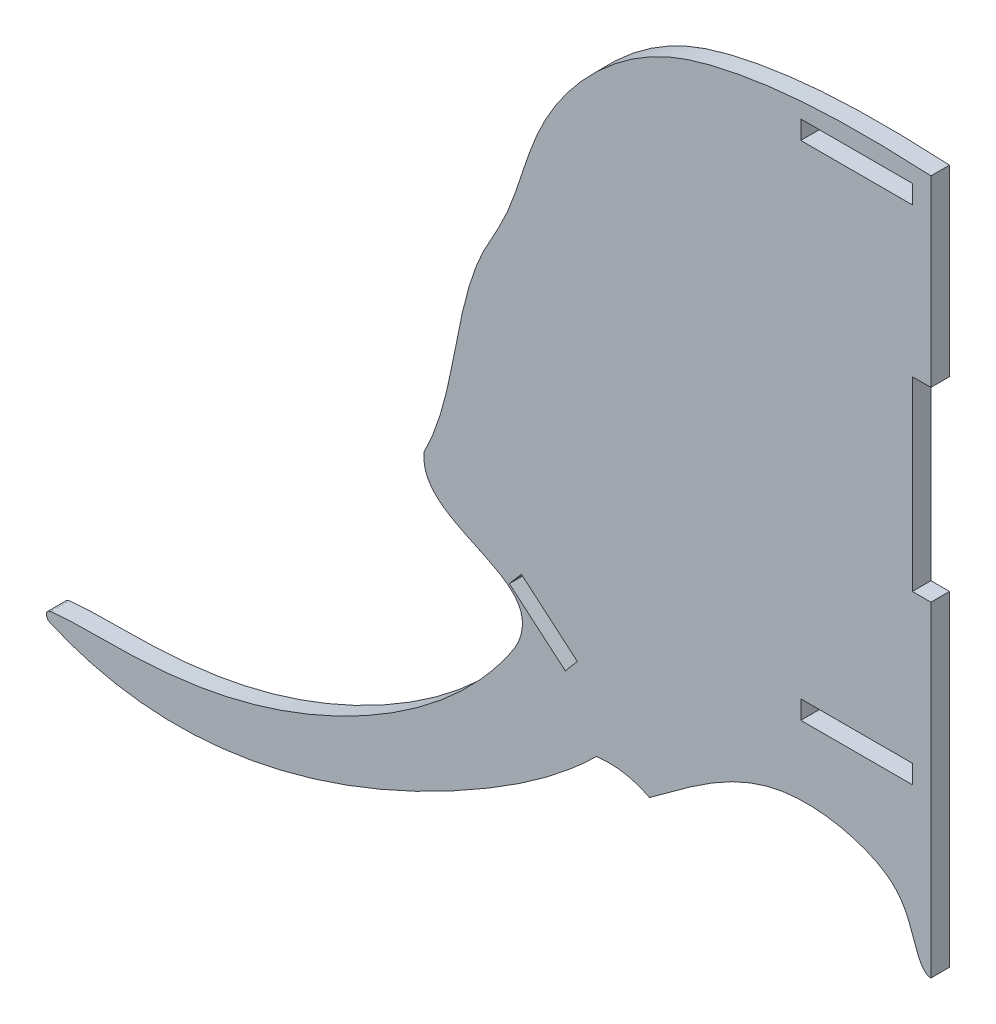
ISO-10303-21;
HEADER;
FILE_DESCRIPTION(('STEP AP214'),'2;1');
FILE_NAME('part.step','',(''),(''),'','','');
FILE_SCHEMA(('AUTOMOTIVE_DESIGN { 1 0 10303 214 1 1 1 1 }'));
ENDSEC;
DATA;
#1=APPLICATION_CONTEXT('core data for automotive mechanical design processes');
#2=APPLICATION_PROTOCOL_DEFINITION('international standard','automotive_design',2000,#1);
#3=PRODUCT_CONTEXT('',#1,'mechanical');
#4=PRODUCT('Part','Part','',(#3));
#5=PRODUCT_RELATED_PRODUCT_CATEGORY('part','',(#4));
#6=PRODUCT_DEFINITION_FORMATION('','',#4);
#7=PRODUCT_DEFINITION_CONTEXT('part definition',#1,'design');
#8=PRODUCT_DEFINITION('design','',#6,#7);
#9=PRODUCT_DEFINITION_SHAPE('','',#8);
#10=(LENGTH_UNIT() NAMED_UNIT(*) SI_UNIT(.MILLI.,.METRE.));
#11=(NAMED_UNIT(*) PLANE_ANGLE_UNIT() SI_UNIT($,.RADIAN.));
#12=(NAMED_UNIT(*) SI_UNIT($,.STERADIAN.) SOLID_ANGLE_UNIT());
#13=UNCERTAINTY_MEASURE_WITH_UNIT(LENGTH_MEASURE(1.E-05),#10,'distance_accuracy_value','');
#14=(GEOMETRIC_REPRESENTATION_CONTEXT(3) GLOBAL_UNCERTAINTY_ASSIGNED_CONTEXT((#13)) GLOBAL_UNIT_ASSIGNED_CONTEXT((#10,
#11,#12)) REPRESENTATION_CONTEXT('',''));
#15=CARTESIAN_POINT('',(0.,0.,0.));
#16=DIRECTION('',(0.,0.,1.));
#17=DIRECTION('',(1.,0.,0.));
#18=AXIS2_PLACEMENT_3D('',#15,#16,#17);
#19=CARTESIAN_POINT('',(94.508573501451,247.967712181637,3.73356069203025));
#20=DIRECTION('',(0.,0.,1.));
#21=DIRECTION('',(1.,0.,0.));
#22=AXIS2_PLACEMENT_3D('',#19,#20,#21);
#23=PLANE('',#22);
#24=DIRECTION('',(1.,0.,0.));
#25=VECTOR('',#24,1.);
#26=CARTESIAN_POINT('',(94.508573501451,311.602433565563,3.73356069203025));
#27=LINE('',#26,#25);
#28=CARTESIAN_POINT('',(185.419370335576,311.602433565563,3.73356069203025));
#29=VERTEX_POINT('',#28);
#30=CARTESIAN_POINT('',(188.594370335576,311.602433565563,3.73356069203025));
#31=VERTEX_POINT('',#30);
#32=EDGE_CURVE('E231',#29,#31,#27,.T.);
#33=ORIENTED_EDGE('',*,*,#32,.F.);
#34=DIRECTION('',(0.,1.,0.));
#35=VECTOR('',#34,1.);
#36=CARTESIAN_POINT('',(185.419370335576,247.967712181637,3.73356069203025));
#37=LINE('',#36,#35);
#38=CARTESIAN_POINT('',(185.419370335576,343.352433565563,3.73356069203025));
#39=VERTEX_POINT('',#38);
#40=EDGE_CURVE('E233',#29,#39,#37,.T.);
#41=ORIENTED_EDGE('',*,*,#40,.T.);
#42=DIRECTION('',(-1.,0.,0.));
#43=VECTOR('',#42,1.);
#44=CARTESIAN_POINT('',(94.508573501451,343.352433565563,3.73356069203025));
#45=LINE('',#44,#43);
#46=CARTESIAN_POINT('',(188.594370335576,343.352433565563,3.73356069203025));
#47=VERTEX_POINT('',#46);
#48=EDGE_CURVE('E228',#47,#39,#45,.T.);
#49=ORIENTED_EDGE('',*,*,#48,.F.);
#50=DIRECTION('',(0.,1.,0.));
#51=VECTOR('',#50,1.);
#52=CARTESIAN_POINT('',(188.594370335576,256.044180784674,3.73356069203025));
#53=LINE('',#52,#51);
#54=CARTESIAN_POINT('',(188.594370335576,374.625359774708,3.73356069203025));
#55=VERTEX_POINT('',#54);
#56=EDGE_CURVE('E325',#47,#55,#53,.T.);
#57=ORIENTED_EDGE('',*,*,#56,.T.);
#58=CARTESIAN_POINT('',(188.594370335576,374.625359774708,3.73356069203025));
#59=CARTESIAN_POINT('',(176.902723498998,375.254038594376,3.73356069203025));
#60=CARTESIAN_POINT('',(161.721869193318,375.20352020384,3.73356069203025));
#61=CARTESIAN_POINT('',(141.653036259614,369.727996039066,3.73356069203025));
#62=CARTESIAN_POINT('',(129.844490344447,361.163013950383,3.73356069203025));
#63=CARTESIAN_POINT('',(120.192543148774,347.193584535558,3.73356069203025));
#64=CARTESIAN_POINT('',(117.468157819055,334.135539263181,3.73356069203025));
#65=CARTESIAN_POINT('',(106.783979956067,317.107780222526,3.73356069203025));
#66=CARTESIAN_POINT('',(107.748821991235,301.358066115973,3.73356069203025));
#67=CARTESIAN_POINT('',(102.099863307551,290.688486019018,3.73356069203025));
#68=B_SPLINE_CURVE_WITH_KNOTS('',3,(#58,#59,#60,#61,#62,#63,#64,#65,#66,#67),.UNSPECIFIED.,.F.,
.F.,(4,1,1,1,1,1,1,4),(0.,0.256177885566044,0.326770854067347,0.450574258980141,
0.564972920578244,0.689615914149957,0.73575471902178,1.),.UNSPECIFIED.);
#69=CARTESIAN_POINT('',(102.099863307551,290.688486019018,3.73356069203025));
#70=VERTEX_POINT('',#69);
#71=EDGE_CURVE('E332',#55,#70,#68,.T.);
#72=ORIENTED_EDGE('',*,*,#71,.T.);
#73=CARTESIAN_POINT('',(102.099863307551,290.688486019018,3.73356069203025));
#74=CARTESIAN_POINT('',(100.916580225008,281.167967764217,3.73356069203025));
#75=CARTESIAN_POINT('',(120.273282846945,281.610546577158,3.73356069203025));
#76=CARTESIAN_POINT('',(118.535983847767,270.809071152293,3.73356069203025));
#77=CARTESIAN_POINT('',(110.43237198474,258.237819372774,3.73356069203025));
#78=CARTESIAN_POINT('',(91.5085668329795,244.241619737673,3.73356069203025));
#79=CARTESIAN_POINT('',(67.0085052705129,236.394505854137,3.73356069203025));
#80=CARTESIAN_POINT('',(50.2391887562681,235.276016557089,3.73356069203025));
#81=CARTESIAN_POINT('',(41.9604942993806,235.532539786131,3.73356069203025));
#82=CARTESIAN_POINT('',(37.1175600327286,234.971365473784,3.73356069203025));
#83=CARTESIAN_POINT('',(37.8679406667928,233.541882506608,3.73356069203025));
#84=B_SPLINE_CURVE_WITH_KNOTS('',3,(#73,#74,#75,#76,#77,#78,#79,#80,#81,#82,#83),.UNSPECIFIED.,
.F.,.F.,(4,1,1,1,1,1,1,1,4),(0.,0.196782075044125,0.221956903579895,0.252894603761857,
0.570283935596533,0.77661171671314,0.895160825028523,0.978618526289838,1.),.UNSPECIFIED.);
#85=CARTESIAN_POINT('',(37.8679406667928,233.541882506608,3.73356069203025));
#86=VERTEX_POINT('',#85);
#87=EDGE_CURVE('E283',#70,#86,#84,.T.);
#88=ORIENTED_EDGE('',*,*,#87,.T.);
#89=CARTESIAN_POINT('',(37.8679406667928,233.541882506608,3.73356069203025));
#90=CARTESIAN_POINT('',(60.9779467391012,223.19058600784,3.73356069203025));
#91=CARTESIAN_POINT('',(98.116578730049,235.45119219111,3.73356069203025));
#92=CARTESIAN_POINT('',(125.24952284959,254.096867227217,3.73356069203025));
#93=CARTESIAN_POINT('',(131.494723697335,260.231386122044,3.73356069203025));
#94=B_SPLINE_CURVE_WITH_KNOTS('',3,(#89,#90,#91,#92,#93),.UNSPECIFIED.,.F.,.F.,(4,1,4),(0.,
0.742486767697281,1.),.UNSPECIFIED.);
#95=CARTESIAN_POINT('',(131.494723697335,260.231386122044,3.73356069203025));
#96=VERTEX_POINT('',#95);
#97=EDGE_CURVE('E289',#86,#96,#94,.T.);
#98=ORIENTED_EDGE('',*,*,#97,.T.);
#99=CARTESIAN_POINT('',(131.494723697335,260.231386122044,3.73356069203025));
#100=CARTESIAN_POINT('',(136.244910578791,260.895631189413,3.73356069203025));
#101=CARTESIAN_POINT('',(140.54397731345,258.699973971625,3.73356069203025));
#102=B_SPLINE_CURVE_WITH_KNOTS('',2,(#99,#100,#101),.UNSPECIFIED.,.F.,.F.,(3,3),(0.,1.),.UNSPECIFIED.);
#103=CARTESIAN_POINT('',(140.54397731345,258.699973971625,3.73356069203025));
#104=VERTEX_POINT('',#103);
#105=EDGE_CURVE('E298',#96,#104,#102,.T.);
#106=ORIENTED_EDGE('',*,*,#105,.T.);
#107=CARTESIAN_POINT('',(140.54397731345,258.699973971625,3.73356069203025));
#108=CARTESIAN_POINT('',(147.482916849391,263.64316592561,3.73356069203025));
#109=CARTESIAN_POINT('',(159.520749813214,274.070026780651,3.73356069203025));
#110=CARTESIAN_POINT('',(180.131162258216,269.516241270706,3.73356069203025));
#111=CARTESIAN_POINT('',(185.103724291734,263.508693907055,3.73356069203025));
#112=CARTESIAN_POINT('',(186.771872354927,256.061026077075,3.73356069203025));
#113=CARTESIAN_POINT('',(188.594370335576,256.044180784674,3.73356069203025));
#114=B_SPLINE_CURVE_WITH_KNOTS('',3,(#107,#108,#109,#110,#111,#112,#113),.UNSPECIFIED.,.F.,.F.,
(4,1,1,1,4),(0.,0.461148567866959,0.724471904206736,0.870774393200556,1.),.UNSPECIFIED.);
#115=CARTESIAN_POINT('',(188.594370335576,256.044180784674,3.73356069203025));
#116=VERTEX_POINT('',#115);
#117=EDGE_CURVE('E320',#104,#116,#114,.T.);
#118=ORIENTED_EDGE('',*,*,#117,.T.);
#119=EDGE_CURVE('E326',#116,#31,#53,.T.);
#120=ORIENTED_EDGE('',*,*,#119,.T.);
#121=EDGE_LOOP('',(#33,#41,#49,#57,#72,#88,#98,#106,#118,#120));
#122=FACE_BOUND('',#121,.T.);
#123=DIRECTION('',(-0.762165840447724,0.647381828332102,0.));
#124=VECTOR('',#123,1.);
#125=CARTESIAN_POINT('',(118.769063521326,276.529707524185,3.73356069203025));
#126=LINE('',#125,#124);
#127=CARTESIAN_POINT('',(126.1776152477,270.236901539735,3.73356069203025));
#128=VERTEX_POINT('',#127);
#129=CARTESIAN_POINT('',(116.61912256808,278.355862189291,3.73356069203025));
#130=VERTEX_POINT('',#129);
#131=EDGE_CURVE('E281',#128,#130,#126,.T.);
#132=ORIENTED_EDGE('',*,*,#131,.T.);
#133=DIRECTION('',(-0.647381828332102,-0.762165840447724,0.));
#134=VECTOR('',#133,1.);
#135=CARTESIAN_POINT('',(134.984727481499,299.977780030622,3.73356069203025));
#136=LINE('',#135,#134);
#137=CARTESIAN_POINT('',(118.674559873035,280.775738732713,3.73356069203025));
#138=VERTEX_POINT('',#137);
#139=EDGE_CURVE('E269',#138,#130,#136,.T.);
#140=ORIENTED_EDGE('',*,*,#139,.F.);
#141=DIRECTION('',(0.762165840447724,-0.647381828332102,0.));
#142=VECTOR('',#141,1.);
#143=CARTESIAN_POINT('',(143.072126770281,260.052504199509,3.73356069203023));
#144=LINE('',#143,#142);
#145=CARTESIAN_POINT('',(128.233052552654,272.656778083156,3.73356069203025));
#146=VERTEX_POINT('',#145);
#147=EDGE_CURVE('E277',#138,#146,#144,.T.);
#148=ORIENTED_EDGE('',*,*,#147,.T.);
#149=DIRECTION('',(-0.647381828332102,-0.762165840447724,0.));
#150=VECTOR('',#149,1.);
#151=CARTESIAN_POINT('',(144.543220161119,291.858819381065,3.73356069203025));
#152=LINE('',#151,#150);
#153=EDGE_CURVE('E260',#146,#128,#152,.T.);
#154=ORIENTED_EDGE('',*,*,#153,.T.);
#155=EDGE_LOOP('',(#132,#140,#148,#154));
#156=FACE_BOUND('',#155,.T.);
#157=DIRECTION('',(0.,1.,0.));
#158=VECTOR('',#157,1.);
#159=CARTESIAN_POINT('',(166.369370335576,368.752433565563,3.73356069167234));
#160=LINE('',#159,#158);
#161=CARTESIAN_POINT('',(166.369370335576,368.752433565563,3.73356069167234));
#162=VERTEX_POINT('',#161);
#163=CARTESIAN_POINT('',(166.369370335576,371.927433565563,3.73356069203025));
#164=VERTEX_POINT('',#163);
#165=EDGE_CURVE('E236',#162,#164,#160,.T.);
#166=ORIENTED_EDGE('',*,*,#165,.T.);
#167=DIRECTION('',(1.,0.,0.));
#168=VECTOR('',#167,1.);
#169=CARTESIAN_POINT('',(-3.32194779276879,371.927433565563,3.73356069167271));
#170=LINE('',#169,#168);
#171=CARTESIAN_POINT('',(185.419370335576,371.927433565563,3.73356069167234));
#172=VERTEX_POINT('',#171);
#173=EDGE_CURVE('E246',#164,#172,#170,.T.);
#174=ORIENTED_EDGE('',*,*,#173,.T.);
#175=DIRECTION('',(0.,1.,0.));
#176=VECTOR('',#175,1.);
#177=CARTESIAN_POINT('',(185.419370335576,368.752433565563,3.73356069167234));
#178=LINE('',#177,#176);
#179=CARTESIAN_POINT('',(185.419370335576,368.752433565563,3.73356069167234));
#180=VERTEX_POINT('',#179);
#181=EDGE_CURVE('E237',#180,#172,#178,.T.);
#182=ORIENTED_EDGE('',*,*,#181,.F.);
#183=DIRECTION('',(1.,0.,0.));
#184=VECTOR('',#183,1.);
#185=CARTESIAN_POINT('',(94.508573501451,368.752433565563,3.73356069203025));
#186=LINE('',#185,#184);
#187=EDGE_CURVE('E252',#162,#180,#186,.T.);
#188=ORIENTED_EDGE('',*,*,#187,.F.);
#189=EDGE_LOOP('',(#166,#174,#182,#188));
#190=FACE_BOUND('',#189,.T.);
#191=DIRECTION('',(1.,0.,0.));
#192=VECTOR('',#191,1.);
#193=CARTESIAN_POINT('',(94.508573501451,286.202433565563,3.73356069203025));
#194=LINE('',#193,#192);
#195=CARTESIAN_POINT('',(166.369370335576,286.202433565563,3.73356069203025));
#196=VERTEX_POINT('',#195);
#197=CARTESIAN_POINT('',(185.419370335576,286.202433565563,3.73356069203025));
#198=VERTEX_POINT('',#197);
#199=EDGE_CURVE('E214',#196,#198,#194,.T.);
#200=ORIENTED_EDGE('',*,*,#199,.T.);
#201=DIRECTION('',(0.,-1.,0.));
#202=VECTOR('',#201,1.);
#203=CARTESIAN_POINT('',(185.419370335576,247.967712181637,3.73356069203025));
#204=LINE('',#203,#202);
#205=CARTESIAN_POINT('',(185.419370335576,283.027433565563,3.73356069203025));
#206=VERTEX_POINT('',#205);
#207=EDGE_CURVE('E211',#198,#206,#204,.T.);
#208=ORIENTED_EDGE('',*,*,#207,.T.);
#209=DIRECTION('',(1.,0.,0.));
#210=VECTOR('',#209,1.);
#211=CARTESIAN_POINT('',(94.508573501451,283.027433565563,3.73356069203025));
#212=LINE('',#211,#210);
#213=CARTESIAN_POINT('',(166.369370335576,283.027433565563,3.73356069203025));
#214=VERTEX_POINT('',#213);
#215=EDGE_CURVE('E202',#214,#206,#212,.T.);
#216=ORIENTED_EDGE('',*,*,#215,.F.);
#217=DIRECTION('',(0.,-1.,0.));
#218=VECTOR('',#217,1.);
#219=CARTESIAN_POINT('',(166.369370335576,247.967712181637,3.73356069203025));
#220=LINE('',#219,#218);
#221=EDGE_CURVE('E208',#196,#214,#220,.T.);
#222=ORIENTED_EDGE('',*,*,#221,.F.);
#223=EDGE_LOOP('',(#200,#208,#216,#222));
#224=FACE_BOUND('',#223,.T.);
#225=ADVANCED_FACE('F35',(#122,#156,#190,#224),#23,.T.);
#226=CARTESIAN_POINT('',(94.508573501451,247.967712181637,0.558560692388159));
#227=DIRECTION('',(0.,0.,1.));
#228=DIRECTION('',(1.,0.,0.));
#229=AXIS2_PLACEMENT_3D('',#226,#227,#228);
#230=PLANE('',#229);
#231=DIRECTION('',(-0.762165840447724,0.647381828332102,0.));
#232=VECTOR('',#231,1.);
#233=CARTESIAN_POINT('',(118.769063521326,276.529707524185,0.558560692388159));
#234=LINE('',#233,#232);
#235=CARTESIAN_POINT('',(126.1776152477,270.236901539735,0.558560692388159));
#236=VERTEX_POINT('',#235);
#237=CARTESIAN_POINT('',(116.61912256808,278.355862189291,0.558560692388159));
#238=VERTEX_POINT('',#237);
#239=EDGE_CURVE('E595',#236,#238,#234,.T.);
#240=ORIENTED_EDGE('',*,*,#239,.F.);
#241=DIRECTION('',(-0.647381828332102,-0.762165840447724,0.));
#242=VECTOR('',#241,1.);
#243=CARTESIAN_POINT('',(144.543220161119,291.858819381065,0.558560692388159));
#244=LINE('',#243,#242);
#245=CARTESIAN_POINT('',(128.233052552654,272.656778083156,0.558560692388159));
#246=VERTEX_POINT('',#245);
#247=EDGE_CURVE('E261',#246,#236,#244,.T.);
#248=ORIENTED_EDGE('',*,*,#247,.F.);
#249=DIRECTION('',(0.762165840447724,-0.647381828332102,0.));
#250=VECTOR('',#249,1.);
#251=CARTESIAN_POINT('',(120.824500826281,278.949584067606,0.558560692388159));
#252=LINE('',#251,#250);
#253=CARTESIAN_POINT('',(118.674559873035,280.775738732713,0.558560692388159));
#254=VERTEX_POINT('',#253);
#255=EDGE_CURVE('E594',#254,#246,#252,.T.);
#256=ORIENTED_EDGE('',*,*,#255,.F.);
#257=DIRECTION('',(-0.647381828332102,-0.762165840447724,0.));
#258=VECTOR('',#257,1.);
#259=CARTESIAN_POINT('',(134.984727481499,299.977780030622,0.558560692388159));
#260=LINE('',#259,#258);
#261=EDGE_CURVE('E268',#254,#238,#260,.T.);
#262=ORIENTED_EDGE('',*,*,#261,.T.);
#263=EDGE_LOOP('',(#240,#248,#256,#262));
#264=FACE_BOUND('',#263,.T.);
#265=DIRECTION('',(1.,0.,0.));
#266=VECTOR('',#265,1.);
#267=CARTESIAN_POINT('',(94.508573501451,368.752433565563,0.558560692388159));
#268=LINE('',#267,#266);
#269=CARTESIAN_POINT('',(166.369370335576,368.752433565563,0.558560692388159));
#270=VERTEX_POINT('',#269);
#271=CARTESIAN_POINT('',(185.419370335576,368.752433565563,0.558560692388159));
#272=VERTEX_POINT('',#271);
#273=EDGE_CURVE('E589',#270,#272,#268,.T.);
#274=ORIENTED_EDGE('',*,*,#273,.T.);
#275=DIRECTION('',(0.,1.,0.));
#276=VECTOR('',#275,1.);
#277=CARTESIAN_POINT('',(185.419370335576,247.967712181637,0.558560692388159));
#278=LINE('',#277,#276);
#279=CARTESIAN_POINT('',(185.419370335576,371.927433565563,0.558560692388159));
#280=VERTEX_POINT('',#279);
#281=EDGE_CURVE('E578',#272,#280,#278,.T.);
#282=ORIENTED_EDGE('',*,*,#281,.T.);
#283=DIRECTION('',(1.,0.,0.));
#284=VECTOR('',#283,1.);
#285=CARTESIAN_POINT('',(94.508573501451,371.927433565563,0.558560692388159));
#286=LINE('',#285,#284);
#287=CARTESIAN_POINT('',(166.369370335576,371.927433565563,0.558560692388159));
#288=VERTEX_POINT('',#287);
#289=EDGE_CURVE('E587',#288,#280,#286,.T.);
#290=ORIENTED_EDGE('',*,*,#289,.F.);
#291=DIRECTION('',(0.,1.,0.));
#292=VECTOR('',#291,1.);
#293=CARTESIAN_POINT('',(166.369370335576,247.967712181637,0.558560692388159));
#294=LINE('',#293,#292);
#295=EDGE_CURVE('E592',#270,#288,#294,.T.);
#296=ORIENTED_EDGE('',*,*,#295,.F.);
#297=EDGE_LOOP('',(#274,#282,#290,#296));
#298=FACE_BOUND('',#297,.T.);
#299=DIRECTION('',(1.,0.,0.));
#300=VECTOR('',#299,1.);
#301=CARTESIAN_POINT('',(185.419370335576,311.602433565563,0.558560692388159));
#302=LINE('',#301,#300);
#303=CARTESIAN_POINT('',(185.419370335576,311.602433565563,0.558560692388159));
#304=VERTEX_POINT('',#303);
#305=CARTESIAN_POINT('',(188.594370335576,311.602433565563,0.558560692388159));
#306=VERTEX_POINT('',#305);
#307=EDGE_CURVE('E225',#304,#306,#302,.T.);
#308=ORIENTED_EDGE('',*,*,#307,.T.);
#309=DIRECTION('',(0.,1.,0.));
#310=VECTOR('',#309,1.);
#311=CARTESIAN_POINT('',(188.594370335576,256.044180784674,0.558560692388159));
#312=LINE('',#311,#310);
#313=CARTESIAN_POINT('',(188.594370335576,256.044180784674,0.558560692388159));
#314=VERTEX_POINT('',#313);
#315=EDGE_CURVE('E564',#314,#306,#312,.T.);
#316=ORIENTED_EDGE('',*,*,#315,.F.);
#317=CARTESIAN_POINT('',(140.54397731345,258.699973971625,0.558560692388159));
#318=CARTESIAN_POINT('',(147.482916849391,263.64316592561,0.558560692388159));
#319=CARTESIAN_POINT('',(159.520749813214,274.070026780651,0.558560692388159));
#320=CARTESIAN_POINT('',(180.131162258216,269.516241270706,0.558560692388159));
#321=CARTESIAN_POINT('',(185.103724291734,263.508693907055,0.558560692388159));
#322=CARTESIAN_POINT('',(186.771872354927,256.061026077075,0.558560692388159));
#323=CARTESIAN_POINT('',(188.594370335576,256.044180784674,0.558560692388159));
#324=B_SPLINE_CURVE_WITH_KNOTS('',3,(#317,#318,#319,#320,#321,#322,#323),.UNSPECIFIED.,.F.,.F.,
(4,1,1,1,4),(0.,0.461148567866959,0.724471904206736,0.870774393200556,1.),.UNSPECIFIED.);
#325=CARTESIAN_POINT('',(140.54397731345,258.699973971625,0.558560692388159));
#326=VERTEX_POINT('',#325);
#327=EDGE_CURVE('E620',#326,#314,#324,.T.);
#328=ORIENTED_EDGE('',*,*,#327,.F.);
#329=CARTESIAN_POINT('',(131.494723697335,260.231386122044,0.558560692388159));
#330=CARTESIAN_POINT('',(136.244910578791,260.895631189413,0.558560692388159));
#331=CARTESIAN_POINT('',(140.54397731345,258.699973971625,0.558560692388159));
#332=B_SPLINE_CURVE_WITH_KNOTS('',2,(#329,#330,#331),.UNSPECIFIED.,.F.,.F.,(3,3),(0.,1.),.UNSPECIFIED.);
#333=CARTESIAN_POINT('',(131.494723697335,260.231386122044,0.558560692388159));
#334=VERTEX_POINT('',#333);
#335=EDGE_CURVE('E624',#334,#326,#332,.T.);
#336=ORIENTED_EDGE('',*,*,#335,.F.);
#337=CARTESIAN_POINT('',(37.8679406667928,233.541882506608,0.558560692388159));
#338=CARTESIAN_POINT('',(60.9779467391012,223.19058600784,0.558560692388159));
#339=CARTESIAN_POINT('',(98.116578730049,235.45119219111,0.558560692388159));
#340=CARTESIAN_POINT('',(125.24952284959,254.096867227217,0.558560692388159));
#341=CARTESIAN_POINT('',(131.494723697335,260.231386122044,0.558560692388159));
#342=B_SPLINE_CURVE_WITH_KNOTS('',3,(#337,#338,#339,#340,#341),.UNSPECIFIED.,.F.,.F.,(4,1,4),
(0.,0.742486767697281,1.),.UNSPECIFIED.);
#343=CARTESIAN_POINT('',(37.8679406667928,233.541882506608,0.558560692388159));
#344=VERTEX_POINT('',#343);
#345=EDGE_CURVE('E630',#344,#334,#342,.T.);
#346=ORIENTED_EDGE('',*,*,#345,.F.);
#347=CARTESIAN_POINT('',(102.099863307551,290.688486019018,0.558560692388159));
#348=CARTESIAN_POINT('',(100.916580225008,281.167967764217,0.558560692388159));
#349=CARTESIAN_POINT('',(120.273282846945,281.610546577158,0.558560692388159));
#350=CARTESIAN_POINT('',(118.535983847767,270.809071152293,0.558560692388159));
#351=CARTESIAN_POINT('',(110.43237198474,258.237819372774,0.558560692388159));
#352=CARTESIAN_POINT('',(91.5085668329795,244.241619737673,0.558560692388159));
#353=CARTESIAN_POINT('',(67.0085052705129,236.394505854137,0.558560692388159));
#354=CARTESIAN_POINT('',(50.2391887562681,235.276016557089,0.558560692388159));
#355=CARTESIAN_POINT('',(41.9604942993806,235.532539786131,0.558560692388159));
#356=CARTESIAN_POINT('',(37.1175600327286,234.971365473784,0.558560692388159));
#357=CARTESIAN_POINT('',(37.8679406667928,233.541882506608,0.558560692388159));
#358=B_SPLINE_CURVE_WITH_KNOTS('',3,(#347,#348,#349,#350,#351,#352,#353,#354,#355,#356,#357),
.UNSPECIFIED.,.F.,.F.,(4,1,1,1,1,1,1,1,4),(0.,0.196782075044125,0.221956903579895,
0.252894603761857,0.570283935596533,0.77661171671314,0.895160825028523,0.978618526289838,1.),.UNSPECIFIED.);
#359=CARTESIAN_POINT('',(102.099863307551,290.688486019018,0.558560692388159));
#360=VERTEX_POINT('',#359);
#361=EDGE_CURVE('E282',#360,#344,#358,.T.);
#362=ORIENTED_EDGE('',*,*,#361,.F.);
#363=CARTESIAN_POINT('',(188.594370335576,374.625359774708,0.558560692388159));
#364=CARTESIAN_POINT('',(176.902723498998,375.254038594376,0.558560692388159));
#365=CARTESIAN_POINT('',(161.721869193318,375.20352020384,0.558560692388159));
#366=CARTESIAN_POINT('',(141.653036259614,369.727996039066,0.558560692388159));
#367=CARTESIAN_POINT('',(129.844490344447,361.163013950383,0.558560692388159));
#368=CARTESIAN_POINT('',(120.192543148774,347.193584535558,0.558560692388159));
#369=CARTESIAN_POINT('',(117.468157819055,334.135539263181,0.558560692388159));
#370=CARTESIAN_POINT('',(106.783979956067,317.107780222526,0.558560692388159));
#371=CARTESIAN_POINT('',(107.748821991235,301.358066115973,0.558560692388159));
#372=CARTESIAN_POINT('',(102.099863307551,290.688486019018,0.558560692388159));
#373=B_SPLINE_CURVE_WITH_KNOTS('',3,(#363,#364,#365,#366,#367,#368,#369,#370,#371,#372),
.UNSPECIFIED.,.F.,.F.,(4,1,1,1,1,1,1,4),(0.,0.256177885566044,0.326770854067347,
0.450574258980141,0.564972920578244,0.689615914149957,0.73575471902178,1.),.UNSPECIFIED.);
#374=CARTESIAN_POINT('',(188.594370335576,374.625359774708,0.558560692388159));
#375=VERTEX_POINT('',#374);
#376=EDGE_CURVE('E290',#375,#360,#373,.T.);
#377=ORIENTED_EDGE('',*,*,#376,.F.);
#378=CARTESIAN_POINT('',(188.594370335576,343.352433565563,0.558560692388159));
#379=VERTEX_POINT('',#378);
#380=EDGE_CURVE('E572',#379,#375,#312,.T.);
#381=ORIENTED_EDGE('',*,*,#380,.F.);
#382=DIRECTION('',(1.,0.,0.));
#383=VECTOR('',#382,1.);
#384=CARTESIAN_POINT('',(185.419370335576,343.352433565563,0.558560692388159));
#385=LINE('',#384,#383);
#386=CARTESIAN_POINT('',(185.419370335576,343.352433565563,0.558560692388159));
#387=VERTEX_POINT('',#386);
#388=EDGE_CURVE('E223',#387,#379,#385,.T.);
#389=ORIENTED_EDGE('',*,*,#388,.F.);
#390=DIRECTION('',(0.,1.,0.));
#391=VECTOR('',#390,1.);
#392=CARTESIAN_POINT('',(185.419370335576,247.967712181637,0.558560692388159));
#393=LINE('',#392,#391);
#394=EDGE_CURVE('E189',#304,#387,#393,.T.);
#395=ORIENTED_EDGE('',*,*,#394,.F.);
#396=EDGE_LOOP('',(#308,#316,#328,#336,#346,#362,#377,#381,#389,#395));
#397=FACE_BOUND('',#396,.T.);
#398=DIRECTION('',(0.,1.,0.));
#399=VECTOR('',#398,1.);
#400=CARTESIAN_POINT('',(185.419370335576,283.027433565563,0.558560690595601));
#401=LINE('',#400,#399);
#402=CARTESIAN_POINT('',(185.419370335576,283.027433565563,0.558560690595601));
#403=VERTEX_POINT('',#402);
#404=CARTESIAN_POINT('',(185.419370335576,286.202433565563,0.558560690595601));
#405=VERTEX_POINT('',#404);
#406=EDGE_CURVE('E187',#403,#405,#401,.T.);
#407=ORIENTED_EDGE('',*,*,#406,.T.);
#408=DIRECTION('',(1.,0.,0.));
#409=VECTOR('',#408,1.);
#410=CARTESIAN_POINT('',(94.508573501451,286.202433565563,0.558560692388159));
#411=LINE('',#410,#409);
#412=CARTESIAN_POINT('',(166.369370335576,286.202433565563,0.558560690595601));
#413=VERTEX_POINT('',#412);
#414=EDGE_CURVE('E11',#413,#405,#411,.T.);
#415=ORIENTED_EDGE('',*,*,#414,.F.);
#416=DIRECTION('',(0.,1.,0.));
#417=VECTOR('',#416,1.);
#418=CARTESIAN_POINT('',(166.369370335576,283.027433565563,0.558560690595601));
#419=LINE('',#418,#417);
#420=CARTESIAN_POINT('',(166.369370335576,283.027433565563,0.558560692388159));
#421=VERTEX_POINT('',#420);
#422=EDGE_CURVE('E188',#421,#413,#419,.T.);
#423=ORIENTED_EDGE('',*,*,#422,.F.);
#424=DIRECTION('',(1.,0.,0.));
#425=VECTOR('',#424,1.);
#426=CARTESIAN_POINT('',(94.508573501451,283.027433565563,0.558560692388159));
#427=LINE('',#426,#425);
#428=EDGE_CURVE('E44',#421,#403,#427,.T.);
#429=ORIENTED_EDGE('',*,*,#428,.T.);
#430=EDGE_LOOP('',(#407,#415,#423,#429));
#431=FACE_BOUND('',#430,.T.);
#432=ADVANCED_FACE('F186',(#264,#298,#397,#431),#230,.F.);
#433=CARTESIAN_POINT('',(188.594370335576,256.044180784674,3.73356069203025));
#434=DIRECTION('',(-1.,0.,0.));
#435=DIRECTION('',(0.,0.,1.));
#436=AXIS2_PLACEMENT_3D('',#433,#434,#435);
#437=PLANE('',#436);
#438=ORIENTED_EDGE('',*,*,#315,.T.);
#439=DIRECTION('',(0.,0.,1.));
#440=VECTOR('',#439,1.);
#441=CARTESIAN_POINT('',(188.594370335576,311.602433565563,3.73356069203025));
#442=LINE('',#441,#440);
#443=EDGE_CURVE('E567',#306,#31,#442,.T.);
#444=ORIENTED_EDGE('',*,*,#443,.T.);
#445=ORIENTED_EDGE('',*,*,#119,.F.);
#446=DIRECTION('',(0.,0.,-1.));
#447=VECTOR('',#446,1.);
#448=CARTESIAN_POINT('',(188.594370335576,256.044180784674,3.73356069203025));
#449=LINE('',#448,#447);
#450=EDGE_CURVE('E569',#116,#314,#449,.T.);
#451=ORIENTED_EDGE('',*,*,#450,.T.);
#452=EDGE_LOOP('',(#438,#444,#445,#451));
#453=FACE_BOUND('',#452,.T.);
#454=ADVANCED_FACE('F351',(#453),#437,.F.);
#455=DIRECTION('',(0.,0.,-1.));
#456=VECTOR('',#455,1.);
#457=SURFACE_OF_LINEAR_EXTRUSION('',#84,#456);
#458=ORIENTED_EDGE('',*,*,#361,.T.);
#459=DIRECTION('',(0.,0.,-1.));
#460=VECTOR('',#459,1.);
#461=CARTESIAN_POINT('',(37.8679406667928,233.541882506608,3.73356069203025));
#462=LINE('',#461,#460);
#463=EDGE_CURVE('E597',#86,#344,#462,.T.);
#464=ORIENTED_EDGE('',*,*,#463,.F.);
#465=ORIENTED_EDGE('',*,*,#87,.F.);
#466=DIRECTION('',(0.,0.,-1.));
#467=VECTOR('',#466,1.);
#468=CARTESIAN_POINT('',(102.099863307551,290.688486019018,3.73356069203025));
#469=LINE('',#468,#467);
#470=EDGE_CURVE('E337',#70,#360,#469,.T.);
#471=ORIENTED_EDGE('',*,*,#470,.T.);
#472=EDGE_LOOP('',(#458,#464,#465,#471));
#473=FACE_BOUND('',#472,.T.);
#474=ADVANCED_FACE('F37',(#473),#457,.F.);
#475=DIRECTION('',(0.,0.,-1.));
#476=VECTOR('',#475,1.);
#477=SURFACE_OF_LINEAR_EXTRUSION('',#94,#476);
#478=ORIENTED_EDGE('',*,*,#345,.T.);
#479=DIRECTION('',(0.,0.,-1.));
#480=VECTOR('',#479,1.);
#481=CARTESIAN_POINT('',(131.494723697335,260.231386122044,3.73356069203025));
#482=LINE('',#481,#480);
#483=EDGE_CURVE('E602',#96,#334,#482,.T.);
#484=ORIENTED_EDGE('',*,*,#483,.F.);
#485=ORIENTED_EDGE('',*,*,#97,.F.);
#486=ORIENTED_EDGE('',*,*,#463,.T.);
#487=EDGE_LOOP('',(#478,#484,#485,#486));
#488=FACE_BOUND('',#487,.T.);
#489=ADVANCED_FACE('F306',(#488),#477,.F.);
#490=DIRECTION('',(0.,0.,-1.));
#491=VECTOR('',#490,1.);
#492=SURFACE_OF_LINEAR_EXTRUSION('',#102,#491);
#493=ORIENTED_EDGE('',*,*,#335,.T.);
#494=DIRECTION('',(0.,0.,-1.));
#495=VECTOR('',#494,1.);
#496=CARTESIAN_POINT('',(140.54397731345,258.699973971625,3.73356069203025));
#497=LINE('',#496,#495);
#498=EDGE_CURVE('E605',#104,#326,#497,.T.);
#499=ORIENTED_EDGE('',*,*,#498,.F.);
#500=ORIENTED_EDGE('',*,*,#105,.F.);
#501=ORIENTED_EDGE('',*,*,#483,.T.);
#502=EDGE_LOOP('',(#493,#499,#500,#501));
#503=FACE_BOUND('',#502,.T.);
#504=ADVANCED_FACE('F309',(#503),#492,.F.);
#505=DIRECTION('',(0.,0.,-1.));
#506=VECTOR('',#505,1.);
#507=SURFACE_OF_LINEAR_EXTRUSION('',#114,#506);
#508=ORIENTED_EDGE('',*,*,#327,.T.);
#509=ORIENTED_EDGE('',*,*,#450,.F.);
#510=ORIENTED_EDGE('',*,*,#117,.F.);
#511=ORIENTED_EDGE('',*,*,#498,.T.);
#512=EDGE_LOOP('',(#508,#509,#510,#511));
#513=FACE_BOUND('',#512,.T.);
#514=ADVANCED_FACE('F313',(#513),#507,.F.);
#515=ORIENTED_EDGE('',*,*,#56,.F.);
#516=DIRECTION('',(0.,0.,1.));
#517=VECTOR('',#516,1.);
#518=CARTESIAN_POINT('',(188.594370335576,343.352433565563,6.90856069167233));
#519=LINE('',#518,#517);
#520=EDGE_CURVE('E217',#379,#47,#519,.T.);
#521=ORIENTED_EDGE('',*,*,#520,.F.);
#522=ORIENTED_EDGE('',*,*,#380,.T.);
#523=DIRECTION('',(0.,0.,-1.));
#524=VECTOR('',#523,1.);
#525=CARTESIAN_POINT('',(188.594370335576,374.625359774708,3.73356069203025));
#526=LINE('',#525,#524);
#527=EDGE_CURVE('E609',#55,#375,#526,.T.);
#528=ORIENTED_EDGE('',*,*,#527,.F.);
#529=EDGE_LOOP('',(#515,#521,#522,#528));
#530=FACE_BOUND('',#529,.T.);
#531=ADVANCED_FACE('F317',(#530),#437,.F.);
#532=DIRECTION('',(0.,0.,-1.));
#533=VECTOR('',#532,1.);
#534=SURFACE_OF_LINEAR_EXTRUSION('',#68,#533);
#535=ORIENTED_EDGE('',*,*,#376,.T.);
#536=ORIENTED_EDGE('',*,*,#470,.F.);
#537=ORIENTED_EDGE('',*,*,#71,.F.);
#538=ORIENTED_EDGE('',*,*,#527,.T.);
#539=EDGE_LOOP('',(#535,#536,#537,#538));
#540=FACE_BOUND('',#539,.T.);
#541=ADVANCED_FACE('F344',(#540),#534,.F.);
#542=CARTESIAN_POINT('',(102.099863307551,290.688486019018,6.90856069274607));
#543=DIRECTION('',(0.647381828332102,0.762165840447724,0.));
#544=DIRECTION('',(0.762165840447724,-0.647381828332102,0.));
#545=AXIS2_PLACEMENT_3D('',#542,#543,#544);
#546=PLANE('',#545);
#547=ORIENTED_EDGE('',*,*,#131,.F.);
#548=DIRECTION('',(0.,0.,-1.));
#549=VECTOR('',#548,1.);
#550=CARTESIAN_POINT('',(126.1776152477,270.236901539735,3.73356069203025));
#551=LINE('',#550,#549);
#552=EDGE_CURVE('E257',#128,#236,#551,.T.);
#553=ORIENTED_EDGE('',*,*,#552,.T.);
#554=ORIENTED_EDGE('',*,*,#239,.T.);
#555=DIRECTION('',(0.,0.,1.));
#556=VECTOR('',#555,1.);
#557=CARTESIAN_POINT('',(116.61912256808,278.355862189291,3.73356069203025));
#558=LINE('',#557,#556);
#559=EDGE_CURVE('E263',#238,#130,#558,.T.);
#560=ORIENTED_EDGE('',*,*,#559,.T.);
#561=EDGE_LOOP('',(#547,#553,#554,#560));
#562=FACE_BOUND('',#561,.T.);
#563=ADVANCED_FACE('F347',(#562),#546,.T.);
#564=CARTESIAN_POINT('',(143.072126770281,260.052504199509,6.90856069274607));
#565=DIRECTION('',(-0.647381828332102,-0.762165840447724,0.));
#566=DIRECTION('',(-0.762165840447724,0.647381828332102,0.));
#567=AXIS2_PLACEMENT_3D('',#564,#565,#566);
#568=PLANE('',#567);
#569=ORIENTED_EDGE('',*,*,#147,.F.);
#570=DIRECTION('',(0.,0.,1.));
#571=VECTOR('',#570,1.);
#572=CARTESIAN_POINT('',(118.674559873035,280.775738732713,6.90856069274607));
#573=LINE('',#572,#571);
#574=EDGE_CURVE('E272',#254,#138,#573,.T.);
#575=ORIENTED_EDGE('',*,*,#574,.F.);
#576=ORIENTED_EDGE('',*,*,#255,.T.);
#577=DIRECTION('',(0.,0.,-1.));
#578=VECTOR('',#577,1.);
#579=CARTESIAN_POINT('',(128.233052552654,272.656778083156,6.90856069274607));
#580=LINE('',#579,#578);
#581=EDGE_CURVE('E279',#146,#246,#580,.T.);
#582=ORIENTED_EDGE('',*,*,#581,.F.);
#583=EDGE_LOOP('',(#569,#575,#576,#582));
#584=FACE_BOUND('',#583,.T.);
#585=ADVANCED_FACE('F358',(#584),#568,.T.);
#586=CARTESIAN_POINT('',(134.984727481499,299.977780030622,3.73356069203025));
#587=DIRECTION('',(0.762165840447724,-0.647381828332102,0.));
#588=DIRECTION('',(-0.647381828332102,-0.762165840447724,0.));
#589=AXIS2_PLACEMENT_3D('',#586,#587,#588);
#590=PLANE('',#589);
#591=ORIENTED_EDGE('',*,*,#261,.F.);
#592=ORIENTED_EDGE('',*,*,#574,.T.);
#593=ORIENTED_EDGE('',*,*,#139,.T.);
#594=ORIENTED_EDGE('',*,*,#559,.F.);
#595=EDGE_LOOP('',(#591,#592,#593,#594));
#596=FACE_BOUND('',#595,.T.);
#597=ADVANCED_FACE('F362',(#596),#590,.T.);
#598=CARTESIAN_POINT('',(144.543220161119,291.858819381065,3.73356069203025));
#599=DIRECTION('',(-0.762165840447724,0.647381828332102,0.));
#600=DIRECTION('',(0.647381828332102,0.762165840447724,0.));
#601=AXIS2_PLACEMENT_3D('',#598,#599,#600);
#602=PLANE('',#601);
#603=ORIENTED_EDGE('',*,*,#153,.F.);
#604=ORIENTED_EDGE('',*,*,#581,.T.);
#605=ORIENTED_EDGE('',*,*,#247,.T.);
#606=ORIENTED_EDGE('',*,*,#552,.F.);
#607=EDGE_LOOP('',(#603,#604,#605,#606));
#608=FACE_BOUND('',#607,.T.);
#609=ADVANCED_FACE('F366',(#608),#602,.T.);
#610=CARTESIAN_POINT('',(188.594370335576,371.927433565563,16.4335606916723));
#611=DIRECTION('',(0.,-1.,0.));
#612=DIRECTION('',(0.,0.,-1.));
#613=AXIS2_PLACEMENT_3D('',#610,#611,#612);
#614=PLANE('',#613);
#615=ORIENTED_EDGE('',*,*,#173,.F.);
#616=DIRECTION('',(0.,0.,-1.));
#617=VECTOR('',#616,1.);
#618=CARTESIAN_POINT('',(166.369370335576,371.927433565563,6.90856069167234));
#619=LINE('',#618,#617);
#620=EDGE_CURVE('E243',#164,#288,#619,.T.);
#621=ORIENTED_EDGE('',*,*,#620,.T.);
#622=ORIENTED_EDGE('',*,*,#289,.T.);
#623=DIRECTION('',(0.,0.,-1.));
#624=VECTOR('',#623,1.);
#625=CARTESIAN_POINT('',(185.419370335576,371.927433565563,6.90856069167234));
#626=LINE('',#625,#624);
#627=EDGE_CURVE('E249',#172,#280,#626,.T.);
#628=ORIENTED_EDGE('',*,*,#627,.F.);
#629=EDGE_LOOP('',(#615,#621,#622,#628));
#630=FACE_BOUND('',#629,.T.);
#631=ADVANCED_FACE('F370',(#630),#614,.T.);
#632=CARTESIAN_POINT('',(188.594370335576,368.752433565563,16.4335606916723));
#633=DIRECTION('',(0.,-1.,0.));
#634=DIRECTION('',(0.,0.,-1.));
#635=AXIS2_PLACEMENT_3D('',#632,#633,#634);
#636=PLANE('',#635);
#637=ORIENTED_EDGE('',*,*,#187,.T.);
#638=DIRECTION('',(0.,0.,-1.));
#639=VECTOR('',#638,1.);
#640=CARTESIAN_POINT('',(185.419370335576,368.752433565563,6.90856069167234));
#641=LINE('',#640,#639);
#642=EDGE_CURVE('E247',#180,#272,#641,.T.);
#643=ORIENTED_EDGE('',*,*,#642,.T.);
#644=ORIENTED_EDGE('',*,*,#273,.F.);
#645=DIRECTION('',(0.,0.,-1.));
#646=VECTOR('',#645,1.);
#647=CARTESIAN_POINT('',(166.369370335576,368.752433565563,6.90856069167234));
#648=LINE('',#647,#646);
#649=EDGE_CURVE('E240',#162,#270,#648,.T.);
#650=ORIENTED_EDGE('',*,*,#649,.F.);
#651=EDGE_LOOP('',(#637,#643,#644,#650));
#652=FACE_BOUND('',#651,.T.);
#653=ADVANCED_FACE('F374',(#652),#636,.F.);
#654=CARTESIAN_POINT('',(185.419370335576,368.752433565563,6.90856069167234));
#655=DIRECTION('',(1.,0.,0.));
#656=DIRECTION('',(0.,0.,-1.));
#657=AXIS2_PLACEMENT_3D('',#654,#655,#656);
#658=PLANE('',#657);
#659=ORIENTED_EDGE('',*,*,#642,.F.);
#660=ORIENTED_EDGE('',*,*,#181,.T.);
#661=ORIENTED_EDGE('',*,*,#627,.T.);
#662=ORIENTED_EDGE('',*,*,#281,.F.);
#663=EDGE_LOOP('',(#659,#660,#661,#662));
#664=FACE_BOUND('',#663,.T.);
#665=ADVANCED_FACE('F378',(#664),#658,.F.);
#666=CARTESIAN_POINT('',(166.369370335576,368.752433565563,6.90856069167234));
#667=DIRECTION('',(1.,0.,0.));
#668=DIRECTION('',(0.,0.,-1.));
#669=AXIS2_PLACEMENT_3D('',#666,#667,#668);
#670=PLANE('',#669);
#671=ORIENTED_EDGE('',*,*,#295,.T.);
#672=ORIENTED_EDGE('',*,*,#620,.F.);
#673=ORIENTED_EDGE('',*,*,#165,.F.);
#674=ORIENTED_EDGE('',*,*,#649,.T.);
#675=EDGE_LOOP('',(#671,#672,#673,#674));
#676=FACE_BOUND('',#675,.T.);
#677=ADVANCED_FACE('F380',(#676),#670,.T.);
#678=CARTESIAN_POINT('',(185.419370335576,-2.86984352397673,-3.17495476619245));
#679=DIRECTION('',(1.,0.,0.));
#680=DIRECTION('',(0.,0.,-1.));
#681=AXIS2_PLACEMENT_3D('',#678,#679,#680);
#682=PLANE('',#681);
#683=DIRECTION('',(0.,0.,-1.));
#684=VECTOR('',#683,1.);
#685=CARTESIAN_POINT('',(185.419370335576,311.602433565563,6.90856069167232));
#686=LINE('',#685,#684);
#687=EDGE_CURVE('E221',#29,#304,#686,.T.);
#688=ORIENTED_EDGE('',*,*,#687,.T.);
#689=ORIENTED_EDGE('',*,*,#394,.T.);
#690=DIRECTION('',(0.,0.,1.));
#691=VECTOR('',#690,1.);
#692=CARTESIAN_POINT('',(185.419370335576,343.352433565563,6.90856069167233));
#693=LINE('',#692,#691);
#694=EDGE_CURVE('E218',#387,#39,#693,.T.);
#695=ORIENTED_EDGE('',*,*,#694,.T.);
#696=ORIENTED_EDGE('',*,*,#40,.F.);
#697=EDGE_LOOP('',(#688,#689,#695,#696));
#698=FACE_BOUND('',#697,.T.);
#699=ADVANCED_FACE('F383',(#698),#682,.T.);
#700=CARTESIAN_POINT('',(185.419370335576,311.602433565563,6.90856069167232));
#701=DIRECTION('',(0.,-1.,0.));
#702=DIRECTION('',(-1.,0.,0.));
#703=AXIS2_PLACEMENT_3D('',#700,#701,#702);
#704=PLANE('',#703);
#705=ORIENTED_EDGE('',*,*,#32,.T.);
#706=ORIENTED_EDGE('',*,*,#443,.F.);
#707=ORIENTED_EDGE('',*,*,#307,.F.);
#708=ORIENTED_EDGE('',*,*,#687,.F.);
#709=EDGE_LOOP('',(#705,#706,#707,#708));
#710=FACE_BOUND('',#709,.T.);
#711=ADVANCED_FACE('F392',(#710),#704,.F.);
#712=CARTESIAN_POINT('',(185.419370335576,343.352433565563,6.90856069167233));
#713=DIRECTION('',(0.,1.,0.));
#714=DIRECTION('',(1.,0.,0.));
#715=AXIS2_PLACEMENT_3D('',#712,#713,#714);
#716=PLANE('',#715);
#717=ORIENTED_EDGE('',*,*,#48,.T.);
#718=ORIENTED_EDGE('',*,*,#694,.F.);
#719=ORIENTED_EDGE('',*,*,#388,.T.);
#720=ORIENTED_EDGE('',*,*,#520,.T.);
#721=EDGE_LOOP('',(#717,#718,#719,#720));
#722=FACE_BOUND('',#721,.T.);
#723=ADVANCED_FACE('F388',(#722),#716,.F.);
#724=CARTESIAN_POINT('',(188.594370335576,286.202433565563,64.0585606905956));
#725=DIRECTION('',(0.,-1.,0.));
#726=DIRECTION('',(0.,0.,-1.));
#727=AXIS2_PLACEMENT_3D('',#724,#725,#726);
#728=PLANE('',#727);
#729=DIRECTION('',(0.,0.,1.));
#730=VECTOR('',#729,1.);
#731=CARTESIAN_POINT('',(166.369370335576,286.202433565563,54.5335606905956));
#732=LINE('',#731,#730);
#733=EDGE_CURVE('E51',#413,#196,#732,.T.);
#734=ORIENTED_EDGE('',*,*,#733,.F.);
#735=ORIENTED_EDGE('',*,*,#414,.T.);
#736=DIRECTION('',(0.,0.,1.));
#737=VECTOR('',#736,1.);
#738=CARTESIAN_POINT('',(185.419370335576,286.202433565563,54.5335606905956));
#739=LINE('',#738,#737);
#740=EDGE_CURVE('E197',#405,#198,#739,.T.);
#741=ORIENTED_EDGE('',*,*,#740,.T.);
#742=ORIENTED_EDGE('',*,*,#199,.F.);
#743=EDGE_LOOP('',(#734,#735,#741,#742));
#744=FACE_BOUND('',#743,.T.);
#745=ADVANCED_FACE('F391',(#744),#728,.T.);
#746=CARTESIAN_POINT('',(188.594370335576,283.027433565563,64.0585606905956));
#747=DIRECTION('',(0.,-1.,0.));
#748=DIRECTION('',(0.,0.,-1.));
#749=AXIS2_PLACEMENT_3D('',#746,#747,#748);
#750=PLANE('',#749);
#751=ORIENTED_EDGE('',*,*,#215,.T.);
#752=DIRECTION('',(0.,0.,1.));
#753=VECTOR('',#752,1.);
#754=CARTESIAN_POINT('',(185.419370335576,283.027433565563,54.5335606905956));
#755=LINE('',#754,#753);
#756=EDGE_CURVE('E194',#403,#206,#755,.T.);
#757=ORIENTED_EDGE('',*,*,#756,.F.);
#758=ORIENTED_EDGE('',*,*,#428,.F.);
#759=DIRECTION('',(0.,0.,1.));
#760=VECTOR('',#759,1.);
#761=CARTESIAN_POINT('',(166.369370335576,283.027433565563,54.5335606905956));
#762=LINE('',#761,#760);
#763=EDGE_CURVE('E198',#421,#214,#762,.T.);
#764=ORIENTED_EDGE('',*,*,#763,.T.);
#765=EDGE_LOOP('',(#751,#757,#758,#764));
#766=FACE_BOUND('',#765,.T.);
#767=ADVANCED_FACE('F200',(#766),#750,.F.);
#768=CARTESIAN_POINT('',(185.419370335576,283.027433565563,54.5335606905956));
#769=DIRECTION('',(-1.,0.,0.));
#770=DIRECTION('',(0.,0.,1.));
#771=AXIS2_PLACEMENT_3D('',#768,#769,#770);
#772=PLANE('',#771);
#773=ORIENTED_EDGE('',*,*,#740,.F.);
#774=ORIENTED_EDGE('',*,*,#406,.F.);
#775=ORIENTED_EDGE('',*,*,#756,.T.);
#776=ORIENTED_EDGE('',*,*,#207,.F.);
#777=EDGE_LOOP('',(#773,#774,#775,#776));
#778=FACE_BOUND('',#777,.T.);
#779=ADVANCED_FACE('F193',(#778),#772,.T.);
#780=CARTESIAN_POINT('',(166.369370335576,283.027433565563,54.5335606905956));
#781=DIRECTION('',(-1.,0.,0.));
#782=DIRECTION('',(0.,0.,1.));
#783=AXIS2_PLACEMENT_3D('',#780,#781,#782);
#784=PLANE('',#783);
#785=ORIENTED_EDGE('',*,*,#221,.T.);
#786=ORIENTED_EDGE('',*,*,#763,.F.);
#787=ORIENTED_EDGE('',*,*,#422,.T.);
#788=ORIENTED_EDGE('',*,*,#733,.T.);
#789=EDGE_LOOP('',(#785,#786,#787,#788));
#790=FACE_BOUND('',#789,.T.);
#791=ADVANCED_FACE('F407',(#790),#784,.F.);
#792=CLOSED_SHELL('',(#225,#432,#454,#474,#489,#504,#514,#531,#541,#563,#585,#597,#609,#631,
#653,#665,#677,#699,#711,#723,#745,#767,#779,#791));
#793=MANIFOLD_SOLID_BREP('B2',#792);
#794=ADVANCED_BREP_SHAPE_REPRESENTATION('',(#18,#793),#14);
#795=SHAPE_DEFINITION_REPRESENTATION(#9,#794);
ENDSEC;
END-ISO-10303-21;
